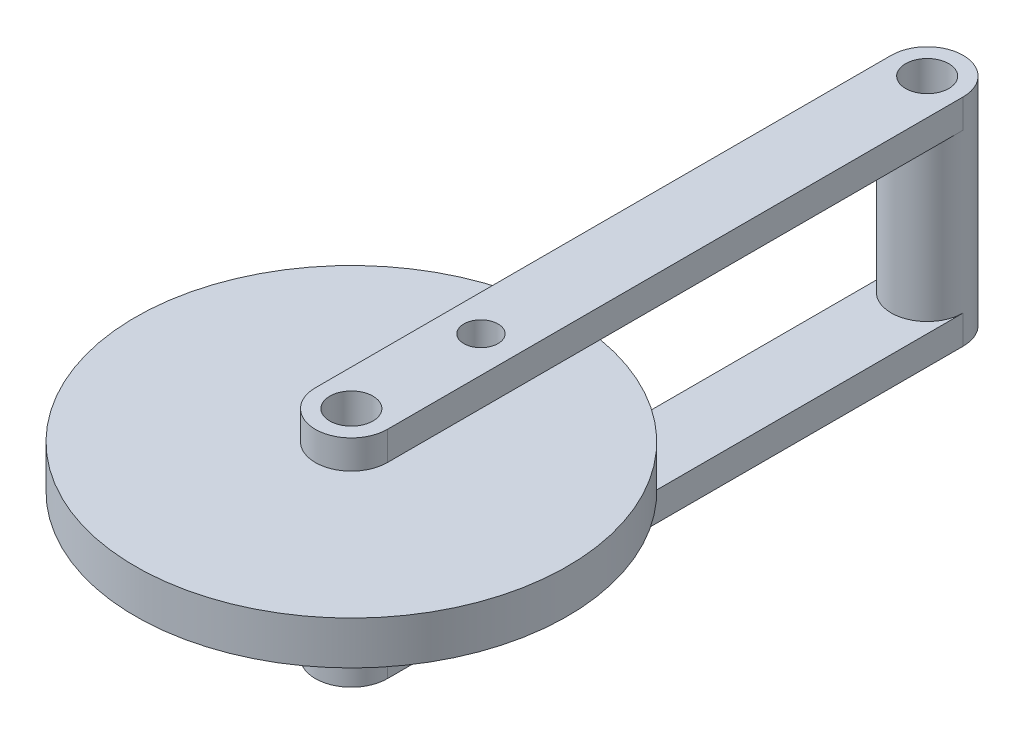
ISO-10303-21;
HEADER;
FILE_DESCRIPTION(('STEP AP214'),'2;1');
FILE_NAME('part.step','',(''),(''),'','','');
FILE_SCHEMA(('AUTOMOTIVE_DESIGN { 1 0 10303 214 1 1 1 1 }'));
ENDSEC;
DATA;
#1=APPLICATION_CONTEXT('core data for automotive mechanical design processes');
#2=APPLICATION_PROTOCOL_DEFINITION('international standard','automotive_design',2000,#1);
#3=PRODUCT_CONTEXT('',#1,'mechanical');
#4=PRODUCT('Part','Part','',(#3));
#5=PRODUCT_RELATED_PRODUCT_CATEGORY('part','',(#4));
#6=PRODUCT_DEFINITION_FORMATION('','',#4);
#7=PRODUCT_DEFINITION_CONTEXT('part definition',#1,'design');
#8=PRODUCT_DEFINITION('design','',#6,#7);
#9=PRODUCT_DEFINITION_SHAPE('','',#8);
#10=(LENGTH_UNIT() NAMED_UNIT(*) SI_UNIT(.MILLI.,.METRE.));
#11=(NAMED_UNIT(*) PLANE_ANGLE_UNIT() SI_UNIT($,.RADIAN.));
#12=(NAMED_UNIT(*) SI_UNIT($,.STERADIAN.) SOLID_ANGLE_UNIT());
#13=UNCERTAINTY_MEASURE_WITH_UNIT(LENGTH_MEASURE(1.E-05),#10,'distance_accuracy_value','');
#14=(GEOMETRIC_REPRESENTATION_CONTEXT(3) GLOBAL_UNCERTAINTY_ASSIGNED_CONTEXT((#13)) GLOBAL_UNIT_ASSIGNED_CONTEXT((#10,
#11,#12)) REPRESENTATION_CONTEXT('',''));
#15=CARTESIAN_POINT('',(0.,0.,0.));
#16=DIRECTION('',(0.,0.,1.));
#17=DIRECTION('',(1.,0.,0.));
#18=AXIS2_PLACEMENT_3D('',#15,#16,#17);
#19=CARTESIAN_POINT('',(0.,2.,0.));
#20=DIRECTION('',(0.,-1.,0.));
#21=DIRECTION('',(0.,0.,-1.));
#22=AXIS2_PLACEMENT_3D('',#19,#20,#21);
#23=CYLINDRICAL_SURFACE('',#22,2.5);
#24=CARTESIAN_POINT('',(0.,0.,0.));
#25=DIRECTION('',(0.,1.,0.));
#26=DIRECTION('',(0.,0.,1.));
#27=AXIS2_PLACEMENT_3D('',#24,#25,#26);
#28=CIRCLE('',#27,2.5);
#29=CARTESIAN_POINT('',(2.5,0.,0.));
#30=VERTEX_POINT('',#29);
#31=CARTESIAN_POINT('',(-2.5,0.,0.));
#32=VERTEX_POINT('',#31);
#33=EDGE_CURVE('E149',#30,#32,#28,.T.);
#34=ORIENTED_EDGE('',*,*,#33,.T.);
#35=DIRECTION('',(0.,-1.,0.));
#36=VECTOR('',#35,1.);
#37=CARTESIAN_POINT('',(-2.5,2.,0.));
#38=LINE('',#37,#36);
#39=CARTESIAN_POINT('',(-2.5,2.,0.));
#40=VERTEX_POINT('',#39);
#41=EDGE_CURVE('E43',#40,#32,#38,.T.);
#42=ORIENTED_EDGE('',*,*,#41,.F.);
#43=CARTESIAN_POINT('',(0.,2.,0.));
#44=DIRECTION('',(0.,1.,0.));
#45=DIRECTION('',(0.,0.,1.));
#46=AXIS2_PLACEMENT_3D('',#43,#44,#45);
#47=CIRCLE('',#46,2.5);
#48=CARTESIAN_POINT('',(2.5,2.,0.));
#49=VERTEX_POINT('',#48);
#50=EDGE_CURVE('E11',#40,#49,#47,.T.);
#51=ORIENTED_EDGE('',*,*,#50,.T.);
#52=DIRECTION('',(0.,-1.,0.));
#53=VECTOR('',#52,1.);
#54=CARTESIAN_POINT('',(2.5,2.,0.));
#55=LINE('',#54,#53);
#56=EDGE_CURVE('E159',#49,#30,#55,.T.);
#57=ORIENTED_EDGE('',*,*,#56,.T.);
#58=EDGE_LOOP('',(#34,#42,#51,#57));
#59=FACE_BOUND('',#58,.T.);
#60=CARTESIAN_POINT('',(0.,13.,0.));
#61=DIRECTION('',(0.,1.,0.));
#62=DIRECTION('',(0.,0.,1.));
#63=AXIS2_PLACEMENT_3D('',#60,#61,#62);
#64=CIRCLE('',#63,2.5);
#65=CARTESIAN_POINT('',(-2.5,13.,0.));
#66=VERTEX_POINT('',#65);
#67=CARTESIAN_POINT('',(2.5,13.,0.));
#68=VERTEX_POINT('',#67);
#69=EDGE_CURVE('E59',#66,#68,#64,.T.);
#70=ORIENTED_EDGE('',*,*,#69,.F.);
#71=DIRECTION('',(0.,-1.,0.));
#72=VECTOR('',#71,1.);
#73=CARTESIAN_POINT('',(-2.5,15.,0.));
#74=LINE('',#73,#72);
#75=CARTESIAN_POINT('',(-2.5,15.,0.));
#76=VERTEX_POINT('',#75);
#77=EDGE_CURVE('E131',#76,#66,#74,.T.);
#78=ORIENTED_EDGE('',*,*,#77,.F.);
#79=CARTESIAN_POINT('',(0.,15.,0.));
#80=DIRECTION('',(0.,1.,0.));
#81=DIRECTION('',(0.,0.,1.));
#82=AXIS2_PLACEMENT_3D('',#79,#80,#81);
#83=CIRCLE('',#82,2.5);
#84=CARTESIAN_POINT('',(2.5,15.,0.));
#85=VERTEX_POINT('',#84);
#86=EDGE_CURVE('E140',#85,#76,#83,.T.);
#87=ORIENTED_EDGE('',*,*,#86,.F.);
#88=DIRECTION('',(0.,-1.,0.));
#89=VECTOR('',#88,1.);
#90=CARTESIAN_POINT('',(2.5,15.,0.));
#91=LINE('',#90,#89);
#92=EDGE_CURVE('E141',#85,#68,#91,.T.);
#93=ORIENTED_EDGE('',*,*,#92,.T.);
#94=EDGE_LOOP('',(#70,#78,#87,#93));
#95=FACE_BOUND('',#94,.T.);
#96=ADVANCED_FACE('F35',(#59,#95),#23,.T.);
#97=CARTESIAN_POINT('',(-2.5,2.,0.));
#98=DIRECTION('',(1.,0.,0.));
#99=DIRECTION('',(0.,0.,-1.));
#100=AXIS2_PLACEMENT_3D('',#97,#98,#99);
#101=PLANE('',#100);
#102=DIRECTION('',(0.,0.,1.));
#103=VECTOR('',#102,1.);
#104=CARTESIAN_POINT('',(-2.5,0.,0.));
#105=LINE('',#104,#103);
#106=CARTESIAN_POINT('',(-2.5,0.,40.));
#107=VERTEX_POINT('',#106);
#108=EDGE_CURVE('E162',#32,#107,#105,.T.);
#109=ORIENTED_EDGE('',*,*,#108,.T.);
#110=DIRECTION('',(0.,-1.,0.));
#111=VECTOR('',#110,1.);
#112=CARTESIAN_POINT('',(-2.5,2.,40.));
#113=LINE('',#112,#111);
#114=CARTESIAN_POINT('',(-2.5,2.,40.));
#115=VERTEX_POINT('',#114);
#116=EDGE_CURVE('E172',#115,#107,#113,.T.);
#117=ORIENTED_EDGE('',*,*,#116,.F.);
#118=DIRECTION('',(0.,0.,1.));
#119=VECTOR('',#118,1.);
#120=CARTESIAN_POINT('',(-2.5,2.,0.));
#121=LINE('',#120,#119);
#122=EDGE_CURVE('E151',#40,#115,#121,.T.);
#123=ORIENTED_EDGE('',*,*,#122,.F.);
#124=ORIENTED_EDGE('',*,*,#41,.T.);
#125=EDGE_LOOP('',(#109,#117,#123,#124));
#126=FACE_BOUND('',#125,.T.);
#127=ADVANCED_FACE('F209',(#126),#101,.F.);
#128=CARTESIAN_POINT('',(0.,2.,40.));
#129=DIRECTION('',(0.,-1.,0.));
#130=DIRECTION('',(0.,0.,-1.));
#131=AXIS2_PLACEMENT_3D('',#128,#129,#130);
#132=CYLINDRICAL_SURFACE('',#131,2.5);
#133=CARTESIAN_POINT('',(0.,0.,40.));
#134=DIRECTION('',(0.,1.,0.));
#135=DIRECTION('',(0.,0.,1.));
#136=AXIS2_PLACEMENT_3D('',#133,#134,#135);
#137=CIRCLE('',#136,2.5);
#138=CARTESIAN_POINT('',(2.5,0.,40.));
#139=VERTEX_POINT('',#138);
#140=EDGE_CURVE('E164',#107,#139,#137,.T.);
#141=ORIENTED_EDGE('',*,*,#140,.T.);
#142=DIRECTION('',(0.,-1.,0.));
#143=VECTOR('',#142,1.);
#144=CARTESIAN_POINT('',(2.5,2.,40.));
#145=LINE('',#144,#143);
#146=CARTESIAN_POINT('',(2.5,2.,40.));
#147=VERTEX_POINT('',#146);
#148=EDGE_CURVE('E170',#147,#139,#145,.T.);
#149=ORIENTED_EDGE('',*,*,#148,.F.);
#150=CARTESIAN_POINT('',(0.,2.,40.));
#151=DIRECTION('',(0.,1.,0.));
#152=DIRECTION('',(0.,0.,1.));
#153=AXIS2_PLACEMENT_3D('',#150,#151,#152);
#154=CIRCLE('',#153,2.5);
#155=EDGE_CURVE('E153',#115,#147,#154,.T.);
#156=ORIENTED_EDGE('',*,*,#155,.F.);
#157=ORIENTED_EDGE('',*,*,#116,.T.);
#158=EDGE_LOOP('',(#141,#149,#156,#157));
#159=FACE_BOUND('',#158,.T.);
#160=ADVANCED_FACE('F214',(#159),#132,.T.);
#161=CARTESIAN_POINT('',(2.5,2.,0.));
#162=DIRECTION('',(1.,0.,0.));
#163=DIRECTION('',(0.,0.,-1.));
#164=AXIS2_PLACEMENT_3D('',#161,#162,#163);
#165=PLANE('',#164);
#166=DIRECTION('',(0.,0.,1.));
#167=VECTOR('',#166,1.);
#168=CARTESIAN_POINT('',(2.5,0.,0.));
#169=LINE('',#168,#167);
#170=EDGE_CURVE('E154',#30,#139,#169,.T.);
#171=ORIENTED_EDGE('',*,*,#170,.F.);
#172=ORIENTED_EDGE('',*,*,#56,.F.);
#173=DIRECTION('',(0.,0.,1.));
#174=VECTOR('',#173,1.);
#175=CARTESIAN_POINT('',(2.5,2.,0.));
#176=LINE('',#175,#174);
#177=EDGE_CURVE('E156',#49,#147,#176,.T.);
#178=ORIENTED_EDGE('',*,*,#177,.T.);
#179=ORIENTED_EDGE('',*,*,#148,.T.);
#180=EDGE_LOOP('',(#171,#172,#178,#179));
#181=FACE_BOUND('',#180,.T.);
#182=ADVANCED_FACE('F224',(#181),#165,.T.);
#183=CARTESIAN_POINT('',(0.,2.,0.));
#184=DIRECTION('',(0.,1.,0.));
#185=DIRECTION('',(0.,0.,1.));
#186=AXIS2_PLACEMENT_3D('',#183,#184,#185);
#187=PLANE('',#186);
#188=CARTESIAN_POINT('',(0.,2.,40.));
#189=DIRECTION('',(0.,1.,0.));
#190=DIRECTION('',(0.,0.,1.));
#191=AXIS2_PLACEMENT_3D('',#188,#189,#190);
#192=CIRCLE('',#191,1.5);
#193=CARTESIAN_POINT('',(0.,2.,41.5));
#194=VERTEX_POINT('',#193);
#195=EDGE_CURVE('E176',#194,#194,#192,.T.);
#196=ORIENTED_EDGE('',*,*,#195,.F.);
#197=EDGE_LOOP('',(#196));
#198=FACE_BOUND('',#197,.T.);
#199=ORIENTED_EDGE('',*,*,#50,.F.);
#200=ORIENTED_EDGE('',*,*,#122,.T.);
#201=ORIENTED_EDGE('',*,*,#155,.T.);
#202=ORIENTED_EDGE('',*,*,#177,.F.);
#203=EDGE_LOOP('',(#199,#200,#201,#202));
#204=FACE_BOUND('',#203,.T.);
#205=ADVANCED_FACE('F231',(#198,#204),#187,.T.);
#206=CARTESIAN_POINT('',(0.,0.,0.));
#207=DIRECTION('',(0.,1.,0.));
#208=DIRECTION('',(0.,0.,1.));
#209=AXIS2_PLACEMENT_3D('',#206,#207,#208);
#210=PLANE('',#209);
#211=CARTESIAN_POINT('',(0.,0.,0.));
#212=DIRECTION('',(0.,1.,0.));
#213=DIRECTION('',(0.,0.,1.));
#214=AXIS2_PLACEMENT_3D('',#211,#212,#213);
#215=CIRCLE('',#214,1.5);
#216=CARTESIAN_POINT('',(0.,0.,1.5));
#217=VERTEX_POINT('',#216);
#218=EDGE_CURVE('E189',#217,#217,#215,.T.);
#219=ORIENTED_EDGE('',*,*,#218,.T.);
#220=EDGE_LOOP('',(#219));
#221=FACE_BOUND('',#220,.T.);
#222=CARTESIAN_POINT('',(0.,0.,40.));
#223=DIRECTION('',(0.,1.,0.));
#224=DIRECTION('',(0.,0.,1.));
#225=AXIS2_PLACEMENT_3D('',#222,#223,#224);
#226=CIRCLE('',#225,1.5);
#227=CARTESIAN_POINT('',(0.,0.,41.5));
#228=VERTEX_POINT('',#227);
#229=EDGE_CURVE('E178',#228,#228,#226,.T.);
#230=ORIENTED_EDGE('',*,*,#229,.T.);
#231=EDGE_LOOP('',(#230));
#232=FACE_BOUND('',#231,.T.);
#233=ORIENTED_EDGE('',*,*,#33,.F.);
#234=ORIENTED_EDGE('',*,*,#170,.T.);
#235=ORIENTED_EDGE('',*,*,#140,.F.);
#236=ORIENTED_EDGE('',*,*,#108,.F.);
#237=EDGE_LOOP('',(#233,#234,#235,#236));
#238=FACE_BOUND('',#237,.T.);
#239=ADVANCED_FACE('F221',(#221,#232,#238),#210,.F.);
#240=CARTESIAN_POINT('',(0.,13.,0.));
#241=DIRECTION('',(0.,1.,0.));
#242=DIRECTION('',(0.,0.,1.));
#243=AXIS2_PLACEMENT_3D('',#240,#241,#242);
#244=PLANE('',#243);
#245=CARTESIAN_POINT('',(0.,13.,40.));
#246=DIRECTION('',(0.,-1.,0.));
#247=DIRECTION('',(0.,0.,-1.));
#248=AXIS2_PLACEMENT_3D('',#245,#246,#247);
#249=CIRCLE('',#248,15.);
#250=CARTESIAN_POINT('',(-2.5,13.,25.209800542251));
#251=VERTEX_POINT('',#250);
#252=CARTESIAN_POINT('',(2.5,13.,25.209800542251));
#253=VERTEX_POINT('',#252);
#254=EDGE_CURVE('E121',#251,#253,#249,.T.);
#255=ORIENTED_EDGE('',*,*,#254,.F.);
#256=DIRECTION('',(0.,0.,1.));
#257=VECTOR('',#256,1.);
#258=CARTESIAN_POINT('',(-2.5,13.,0.));
#259=LINE('',#258,#257);
#260=EDGE_CURVE('E115',#66,#251,#259,.T.);
#261=ORIENTED_EDGE('',*,*,#260,.F.);
#262=ORIENTED_EDGE('',*,*,#69,.T.);
#263=DIRECTION('',(0.,0.,-1.));
#264=VECTOR('',#263,1.);
#265=CARTESIAN_POINT('',(2.5,13.,0.));
#266=LINE('',#265,#264);
#267=EDGE_CURVE('E127',#253,#68,#266,.T.);
#268=ORIENTED_EDGE('',*,*,#267,.F.);
#269=EDGE_LOOP('',(#255,#261,#262,#268));
#270=FACE_BOUND('',#269,.T.);
#271=ADVANCED_FACE('F125',(#270),#244,.F.);
#272=CARTESIAN_POINT('',(-2.5,15.,0.));
#273=DIRECTION('',(1.,0.,0.));
#274=DIRECTION('',(0.,0.,-1.));
#275=AXIS2_PLACEMENT_3D('',#272,#273,#274);
#276=PLANE('',#275);
#277=ORIENTED_EDGE('',*,*,#260,.T.);
#278=DIRECTION('',(0.,0.,-1.));
#279=VECTOR('',#278,1.);
#280=CARTESIAN_POINT('',(-2.5,13.,0.));
#281=LINE('',#280,#279);
#282=CARTESIAN_POINT('',(-2.5,13.,40.));
#283=VERTEX_POINT('',#282);
#284=EDGE_CURVE('E107',#283,#251,#281,.T.);
#285=ORIENTED_EDGE('',*,*,#284,.F.);
#286=DIRECTION('',(0.,-1.,0.));
#287=VECTOR('',#286,1.);
#288=CARTESIAN_POINT('',(-2.5,15.,40.));
#289=LINE('',#288,#287);
#290=CARTESIAN_POINT('',(-2.5,15.,40.));
#291=VERTEX_POINT('',#290);
#292=EDGE_CURVE('E146',#291,#283,#289,.T.);
#293=ORIENTED_EDGE('',*,*,#292,.F.);
#294=DIRECTION('',(0.,0.,1.));
#295=VECTOR('',#294,1.);
#296=CARTESIAN_POINT('',(-2.5,15.,0.));
#297=LINE('',#296,#295);
#298=EDGE_CURVE('E197',#76,#291,#297,.T.);
#299=ORIENTED_EDGE('',*,*,#298,.F.);
#300=ORIENTED_EDGE('',*,*,#77,.T.);
#301=EDGE_LOOP('',(#277,#285,#293,#299,#300));
#302=FACE_BOUND('',#301,.T.);
#303=ADVANCED_FACE('F130',(#302),#276,.F.);
#304=CARTESIAN_POINT('',(0.,15.,40.));
#305=DIRECTION('',(0.,-1.,0.));
#306=DIRECTION('',(0.,0.,-1.));
#307=AXIS2_PLACEMENT_3D('',#304,#305,#306);
#308=CYLINDRICAL_SURFACE('',#307,2.5);
#309=CARTESIAN_POINT('',(0.,13.,40.));
#310=DIRECTION('',(0.,1.,0.));
#311=DIRECTION('',(0.,0.,1.));
#312=AXIS2_PLACEMENT_3D('',#309,#310,#311);
#313=CIRCLE('',#312,2.5);
#314=CARTESIAN_POINT('',(2.5,13.,40.));
#315=VERTEX_POINT('',#314);
#316=EDGE_CURVE('E110',#283,#315,#313,.T.);
#317=ORIENTED_EDGE('',*,*,#316,.T.);
#318=DIRECTION('',(0.,-1.,0.));
#319=VECTOR('',#318,1.);
#320=CARTESIAN_POINT('',(2.5,15.,40.));
#321=LINE('',#320,#319);
#322=CARTESIAN_POINT('',(2.5,15.,40.));
#323=VERTEX_POINT('',#322);
#324=EDGE_CURVE('E143',#323,#315,#321,.T.);
#325=ORIENTED_EDGE('',*,*,#324,.F.);
#326=CARTESIAN_POINT('',(0.,15.,40.));
#327=DIRECTION('',(0.,1.,0.));
#328=DIRECTION('',(0.,0.,1.));
#329=AXIS2_PLACEMENT_3D('',#326,#327,#328);
#330=CIRCLE('',#329,2.5);
#331=EDGE_CURVE('E198',#291,#323,#330,.T.);
#332=ORIENTED_EDGE('',*,*,#331,.F.);
#333=ORIENTED_EDGE('',*,*,#292,.T.);
#334=EDGE_LOOP('',(#317,#325,#332,#333));
#335=FACE_BOUND('',#334,.T.);
#336=ADVANCED_FACE('F282',(#335),#308,.T.);
#337=CARTESIAN_POINT('',(2.5,15.,0.));
#338=DIRECTION('',(-1.,0.,0.));
#339=DIRECTION('',(0.,0.,1.));
#340=AXIS2_PLACEMENT_3D('',#337,#338,#339);
#341=PLANE('',#340);
#342=EDGE_CURVE('E138',#315,#253,#266,.T.);
#343=ORIENTED_EDGE('',*,*,#342,.T.);
#344=ORIENTED_EDGE('',*,*,#267,.T.);
#345=ORIENTED_EDGE('',*,*,#92,.F.);
#346=DIRECTION('',(0.,0.,-1.));
#347=VECTOR('',#346,1.);
#348=CARTESIAN_POINT('',(2.5,15.,0.));
#349=LINE('',#348,#347);
#350=EDGE_CURVE('E135',#323,#85,#349,.T.);
#351=ORIENTED_EDGE('',*,*,#350,.F.);
#352=ORIENTED_EDGE('',*,*,#324,.T.);
#353=EDGE_LOOP('',(#343,#344,#345,#351,#352));
#354=FACE_BOUND('',#353,.T.);
#355=ADVANCED_FACE('F207',(#354),#341,.F.);
#356=CARTESIAN_POINT('',(0.,15.,0.));
#357=DIRECTION('',(0.,1.,0.));
#358=DIRECTION('',(0.,0.,1.));
#359=AXIS2_PLACEMENT_3D('',#356,#357,#358);
#360=PLANE('',#359);
#361=CARTESIAN_POINT('',(0.,15.,31.));
#362=DIRECTION('',(0.,1.,0.));
#363=DIRECTION('',(0.,0.,1.));
#364=AXIS2_PLACEMENT_3D('',#361,#362,#363);
#365=CIRCLE('',#364,1.18745);
#366=CARTESIAN_POINT('',(0.,15.,32.18745));
#367=VERTEX_POINT('',#366);
#368=EDGE_CURVE('E391',#367,#367,#365,.T.);
#369=ORIENTED_EDGE('',*,*,#368,.F.);
#370=EDGE_LOOP('',(#369));
#371=FACE_BOUND('',#370,.T.);
#372=CARTESIAN_POINT('',(0.,15.,0.));
#373=DIRECTION('',(0.,1.,0.));
#374=DIRECTION('',(0.,0.,1.));
#375=AXIS2_PLACEMENT_3D('',#372,#373,#374);
#376=CIRCLE('',#375,1.5);
#377=CARTESIAN_POINT('',(0.,15.,1.5));
#378=VERTEX_POINT('',#377);
#379=EDGE_CURVE('E393',#378,#378,#376,.T.);
#380=ORIENTED_EDGE('',*,*,#379,.F.);
#381=EDGE_LOOP('',(#380));
#382=FACE_BOUND('',#381,.T.);
#383=CARTESIAN_POINT('',(0.,15.,40.));
#384=DIRECTION('',(0.,1.,0.));
#385=DIRECTION('',(0.,0.,1.));
#386=AXIS2_PLACEMENT_3D('',#383,#384,#385);
#387=CIRCLE('',#386,1.5);
#388=CARTESIAN_POINT('',(0.,15.,41.5));
#389=VERTEX_POINT('',#388);
#390=EDGE_CURVE('E184',#389,#389,#387,.T.);
#391=ORIENTED_EDGE('',*,*,#390,.F.);
#392=EDGE_LOOP('',(#391));
#393=FACE_BOUND('',#392,.T.);
#394=ORIENTED_EDGE('',*,*,#86,.T.);
#395=ORIENTED_EDGE('',*,*,#298,.T.);
#396=ORIENTED_EDGE('',*,*,#331,.T.);
#397=ORIENTED_EDGE('',*,*,#350,.T.);
#398=EDGE_LOOP('',(#394,#395,#396,#397));
#399=FACE_BOUND('',#398,.T.);
#400=ADVANCED_FACE('F204',(#371,#382,#393,#399),#360,.T.);
#401=CARTESIAN_POINT('',(0.,13.,40.));
#402=DIRECTION('',(0.,-1.,0.));
#403=DIRECTION('',(0.,0.,-1.));
#404=AXIS2_PLACEMENT_3D('',#401,#402,#403);
#405=PLANE('',#404);
#406=ORIENTED_EDGE('',*,*,#316,.F.);
#407=ORIENTED_EDGE('',*,*,#284,.T.);
#408=EDGE_CURVE('E51',#253,#251,#249,.T.);
#409=ORIENTED_EDGE('',*,*,#408,.F.);
#410=ORIENTED_EDGE('',*,*,#342,.F.);
#411=EDGE_LOOP('',(#406,#407,#409,#410));
#412=FACE_BOUND('',#411,.T.);
#413=ADVANCED_FACE('F108',(#412),#405,.F.);
#414=CARTESIAN_POINT('',(0.,10.,40.));
#415=DIRECTION('',(0.,1.,0.));
#416=DIRECTION('',(0.,0.,1.));
#417=AXIS2_PLACEMENT_3D('',#414,#415,#416);
#418=CYLINDRICAL_SURFACE('',#417,15.);
#419=CARTESIAN_POINT('',(0.,10.,40.));
#420=DIRECTION('',(0.,-1.,0.));
#421=DIRECTION('',(0.,0.,-1.));
#422=AXIS2_PLACEMENT_3D('',#419,#420,#421);
#423=CIRCLE('',#422,15.);
#424=CARTESIAN_POINT('',(0.,10.,25.));
#425=VERTEX_POINT('',#424);
#426=EDGE_CURVE('E116',#425,#425,#423,.T.);
#427=ORIENTED_EDGE('',*,*,#426,.F.);
#428=EDGE_LOOP('',(#427));
#429=FACE_BOUND('',#428,.T.);
#430=ORIENTED_EDGE('',*,*,#408,.T.);
#431=ORIENTED_EDGE('',*,*,#254,.T.);
#432=EDGE_LOOP('',(#430,#431));
#433=FACE_BOUND('',#432,.T.);
#434=ADVANCED_FACE('F120',(#429,#433),#418,.T.);
#435=CARTESIAN_POINT('',(0.,10.,40.));
#436=DIRECTION('',(0.,-1.,0.));
#437=DIRECTION('',(0.,0.,-1.));
#438=AXIS2_PLACEMENT_3D('',#435,#436,#437);
#439=PLANE('',#438);
#440=CARTESIAN_POINT('',(0.,10.,31.));
#441=DIRECTION('',(0.,-1.,0.));
#442=DIRECTION('',(0.,0.,-1.));
#443=AXIS2_PLACEMENT_3D('',#440,#441,#442);
#444=CIRCLE('',#443,1.18745);
#445=CARTESIAN_POINT('',(0.,10.,29.81255));
#446=VERTEX_POINT('',#445);
#447=EDGE_CURVE('E38',#446,#446,#444,.T.);
#448=ORIENTED_EDGE('',*,*,#447,.F.);
#449=EDGE_LOOP('',(#448));
#450=FACE_BOUND('',#449,.T.);
#451=CARTESIAN_POINT('',(0.,10.,40.));
#452=DIRECTION('',(0.,-1.,0.));
#453=DIRECTION('',(0.,0.,-1.));
#454=AXIS2_PLACEMENT_3D('',#451,#452,#453);
#455=CIRCLE('',#454,1.5);
#456=CARTESIAN_POINT('',(0.,10.,38.5));
#457=VERTEX_POINT('',#456);
#458=EDGE_CURVE('E129',#457,#457,#455,.T.);
#459=ORIENTED_EDGE('',*,*,#458,.F.);
#460=EDGE_LOOP('',(#459));
#461=FACE_BOUND('',#460,.T.);
#462=ORIENTED_EDGE('',*,*,#426,.T.);
#463=EDGE_LOOP('',(#462));
#464=FACE_BOUND('',#463,.T.);
#465=ADVANCED_FACE('F315',(#450,#461,#464),#439,.T.);
#466=CARTESIAN_POINT('',(0.,15.,40.));
#467=DIRECTION('',(0.,1.,0.));
#468=DIRECTION('',(0.,0.,1.));
#469=AXIS2_PLACEMENT_3D('',#466,#467,#468);
#470=CYLINDRICAL_SURFACE('',#469,1.5);
#471=ORIENTED_EDGE('',*,*,#195,.T.);
#472=EDGE_LOOP('',(#471));
#473=FACE_BOUND('',#472,.T.);
#474=ORIENTED_EDGE('',*,*,#229,.F.);
#475=EDGE_LOOP('',(#474));
#476=FACE_BOUND('',#475,.T.);
#477=ADVANCED_FACE('F333',(#473,#476),#470,.F.);
#478=ORIENTED_EDGE('',*,*,#458,.T.);
#479=EDGE_LOOP('',(#478));
#480=FACE_BOUND('',#479,.T.);
#481=ORIENTED_EDGE('',*,*,#390,.T.);
#482=EDGE_LOOP('',(#481));
#483=FACE_BOUND('',#482,.T.);
#484=ADVANCED_FACE('F338',(#480,#483),#470,.F.);
#485=CARTESIAN_POINT('',(0.,15.,0.));
#486=DIRECTION('',(0.,1.,0.));
#487=DIRECTION('',(0.,0.,1.));
#488=AXIS2_PLACEMENT_3D('',#485,#486,#487);
#489=CYLINDRICAL_SURFACE('',#488,1.5);
#490=ORIENTED_EDGE('',*,*,#218,.F.);
#491=EDGE_LOOP('',(#490));
#492=FACE_BOUND('',#491,.T.);
#493=ORIENTED_EDGE('',*,*,#379,.T.);
#494=EDGE_LOOP('',(#493));
#495=FACE_BOUND('',#494,.T.);
#496=ADVANCED_FACE('F347',(#492,#495),#489,.F.);
#497=CARTESIAN_POINT('',(0.,15.,31.));
#498=DIRECTION('',(0.,1.,0.));
#499=DIRECTION('',(0.,0.,1.));
#500=AXIS2_PLACEMENT_3D('',#497,#498,#499);
#501=CYLINDRICAL_SURFACE('',#500,1.18745);
#502=ORIENTED_EDGE('',*,*,#447,.T.);
#503=EDGE_LOOP('',(#502));
#504=FACE_BOUND('',#503,.T.);
#505=ORIENTED_EDGE('',*,*,#368,.T.);
#506=EDGE_LOOP('',(#505));
#507=FACE_BOUND('',#506,.T.);
#508=ADVANCED_FACE('F356',(#504,#507),#501,.F.);
#509=CLOSED_SHELL('',(#96,#127,#160,#182,#205,#239,#271,#303,#336,#355,#400,#413,#434,#465,#477,
#484,#496,#508));
#510=MANIFOLD_SOLID_BREP('B2',#509);
#511=ADVANCED_BREP_SHAPE_REPRESENTATION('',(#18,#510),#14);
#512=SHAPE_DEFINITION_REPRESENTATION(#9,#511);
ENDSEC;
END-ISO-10303-21;
